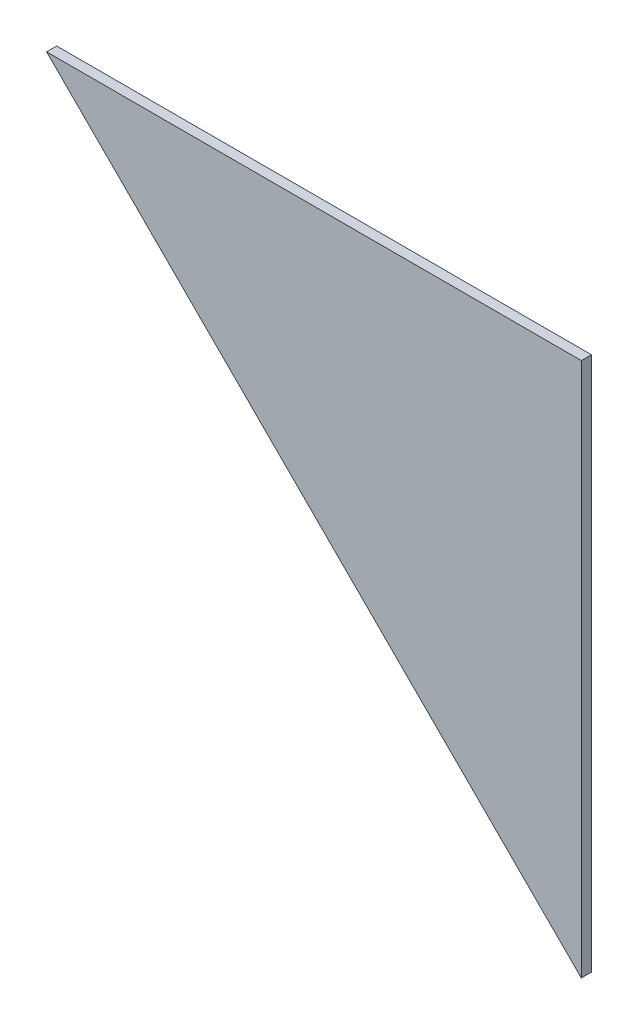
ISO-10303-21;
HEADER;
FILE_DESCRIPTION(('STEP AP214'),'2;1');
FILE_NAME('part.step','',(''),(''),'','','');
FILE_SCHEMA(('AUTOMOTIVE_DESIGN { 1 0 10303 214 1 1 1 1 }'));
ENDSEC;
DATA;
#1=APPLICATION_CONTEXT('core data for automotive mechanical design processes');
#2=APPLICATION_PROTOCOL_DEFINITION('international standard','automotive_design',2000,#1);
#3=PRODUCT_CONTEXT('',#1,'mechanical');
#4=PRODUCT('Part','Part','',(#3));
#5=PRODUCT_RELATED_PRODUCT_CATEGORY('part','',(#4));
#6=PRODUCT_DEFINITION_FORMATION('','',#4);
#7=PRODUCT_DEFINITION_CONTEXT('part definition',#1,'design');
#8=PRODUCT_DEFINITION('design','',#6,#7);
#9=PRODUCT_DEFINITION_SHAPE('','',#8);
#10=(LENGTH_UNIT() NAMED_UNIT(*) SI_UNIT(.MILLI.,.METRE.));
#11=(NAMED_UNIT(*) PLANE_ANGLE_UNIT() SI_UNIT($,.RADIAN.));
#12=(NAMED_UNIT(*) SI_UNIT($,.STERADIAN.) SOLID_ANGLE_UNIT());
#13=UNCERTAINTY_MEASURE_WITH_UNIT(LENGTH_MEASURE(1.E-05),#10,'distance_accuracy_value','');
#14=(GEOMETRIC_REPRESENTATION_CONTEXT(3) GLOBAL_UNCERTAINTY_ASSIGNED_CONTEXT((#13)) GLOBAL_UNIT_ASSIGNED_CONTEXT((#10,
#11,#12)) REPRESENTATION_CONTEXT('',''));
#15=CARTESIAN_POINT('',(0.,0.,0.));
#16=DIRECTION('',(0.,0.,1.));
#17=DIRECTION('',(1.,0.,0.));
#18=AXIS2_PLACEMENT_3D('',#15,#16,#17);
#19=CARTESIAN_POINT('',(-106.066017177982,106.066017177983,2.));
#20=DIRECTION('',(0.707106781186551,0.707106781186544,0.));
#21=DIRECTION('',(-0.707106781186544,0.707106781186551,0.));
#22=AXIS2_PLACEMENT_3D('',#19,#20,#21);
#23=PLANE('',#22);
#24=DIRECTION('',(0.707106781186544,-0.707106781186551,0.));
#25=VECTOR('',#24,1.);
#26=CARTESIAN_POINT('',(-106.066017177982,106.066017177983,0.));
#27=LINE('',#26,#25);
#28=CARTESIAN_POINT('',(-106.066017177982,106.066017177983,0.));
#29=VERTEX_POINT('',#28);
#30=CARTESIAN_POINT('',(0.,0.,0.));
#31=VERTEX_POINT('',#30);
#32=EDGE_CURVE('E80',#29,#31,#27,.T.);
#33=ORIENTED_EDGE('',*,*,#32,.T.);
#34=DIRECTION('',(0.,0.,-1.));
#35=VECTOR('',#34,1.);
#36=CARTESIAN_POINT('',(0.,0.,2.));
#37=LINE('',#36,#35);
#38=CARTESIAN_POINT('',(0.,0.,2.));
#39=VERTEX_POINT('',#38);
#40=EDGE_CURVE('E11',#39,#31,#37,.T.);
#41=ORIENTED_EDGE('',*,*,#40,.F.);
#42=DIRECTION('',(0.707106781186544,-0.707106781186551,0.));
#43=VECTOR('',#42,1.);
#44=CARTESIAN_POINT('',(-106.066017177982,106.066017177983,2.));
#45=LINE('',#44,#43);
#46=CARTESIAN_POINT('',(-106.066017177982,106.066017177983,2.));
#47=VERTEX_POINT('',#46);
#48=EDGE_CURVE('E73',#47,#39,#45,.T.);
#49=ORIENTED_EDGE('',*,*,#48,.F.);
#50=DIRECTION('',(0.,0.,-1.));
#51=VECTOR('',#50,1.);
#52=CARTESIAN_POINT('',(-106.066017177982,106.066017177983,2.));
#53=LINE('',#52,#51);
#54=EDGE_CURVE('E81',#47,#29,#53,.T.);
#55=ORIENTED_EDGE('',*,*,#54,.T.);
#56=EDGE_LOOP('',(#33,#41,#49,#55));
#57=FACE_BOUND('',#56,.T.);
#58=ADVANCED_FACE('F33',(#57),#23,.F.);
#59=CARTESIAN_POINT('',(0.,0.,2.));
#60=DIRECTION('',(-1.,0.,0.));
#61=DIRECTION('',(0.,-1.,0.));
#62=AXIS2_PLACEMENT_3D('',#59,#60,#61);
#63=PLANE('',#62);
#64=DIRECTION('',(0.,1.,0.));
#65=VECTOR('',#64,1.);
#66=CARTESIAN_POINT('',(0.,0.,0.));
#67=LINE('',#66,#65);
#68=CARTESIAN_POINT('',(0.,106.066017177983,0.));
#69=VERTEX_POINT('',#68);
#70=EDGE_CURVE('E61',#31,#69,#67,.T.);
#71=ORIENTED_EDGE('',*,*,#70,.T.);
#72=DIRECTION('',(0.,0.,-1.));
#73=VECTOR('',#72,1.);
#74=CARTESIAN_POINT('',(0.,106.066017177983,2.));
#75=LINE('',#74,#73);
#76=CARTESIAN_POINT('',(0.,106.066017177983,2.));
#77=VERTEX_POINT('',#76);
#78=EDGE_CURVE('E41',#77,#69,#75,.T.);
#79=ORIENTED_EDGE('',*,*,#78,.F.);
#80=DIRECTION('',(0.,1.,0.));
#81=VECTOR('',#80,1.);
#82=CARTESIAN_POINT('',(0.,0.,2.));
#83=LINE('',#82,#81);
#84=EDGE_CURVE('E69',#39,#77,#83,.T.);
#85=ORIENTED_EDGE('',*,*,#84,.F.);
#86=ORIENTED_EDGE('',*,*,#40,.T.);
#87=EDGE_LOOP('',(#71,#79,#85,#86));
#88=FACE_BOUND('',#87,.T.);
#89=ADVANCED_FACE('F70',(#88),#63,.F.);
#90=CARTESIAN_POINT('',(0.,106.066017177983,2.));
#91=DIRECTION('',(0.,-1.,0.));
#92=DIRECTION('',(1.,0.,0.));
#93=AXIS2_PLACEMENT_3D('',#90,#91,#92);
#94=PLANE('',#93);
#95=DIRECTION('',(-1.,0.,0.));
#96=VECTOR('',#95,1.);
#97=CARTESIAN_POINT('',(0.,106.066017177983,0.));
#98=LINE('',#97,#96);
#99=EDGE_CURVE('E66',#69,#29,#98,.T.);
#100=ORIENTED_EDGE('',*,*,#99,.T.);
#101=ORIENTED_EDGE('',*,*,#54,.F.);
#102=DIRECTION('',(-1.,0.,0.));
#103=VECTOR('',#102,1.);
#104=CARTESIAN_POINT('',(0.,106.066017177983,2.));
#105=LINE('',#104,#103);
#106=EDGE_CURVE('E49',#77,#47,#105,.T.);
#107=ORIENTED_EDGE('',*,*,#106,.F.);
#108=ORIENTED_EDGE('',*,*,#78,.T.);
#109=EDGE_LOOP('',(#100,#101,#107,#108));
#110=FACE_BOUND('',#109,.T.);
#111=ADVANCED_FACE('F88',(#110),#94,.F.);
#112=CARTESIAN_POINT('',(0.,0.,2.));
#113=DIRECTION('',(0.,0.,1.));
#114=DIRECTION('',(1.,0.,0.));
#115=AXIS2_PLACEMENT_3D('',#112,#113,#114);
#116=PLANE('',#115);
#117=ORIENTED_EDGE('',*,*,#48,.T.);
#118=ORIENTED_EDGE('',*,*,#84,.T.);
#119=ORIENTED_EDGE('',*,*,#106,.T.);
#120=EDGE_LOOP('',(#117,#118,#119));
#121=FACE_BOUND('',#120,.T.);
#122=ADVANCED_FACE('F76',(#121),#116,.T.);
#123=CARTESIAN_POINT('',(0.,0.,0.));
#124=DIRECTION('',(0.,0.,1.));
#125=DIRECTION('',(1.,0.,0.));
#126=AXIS2_PLACEMENT_3D('',#123,#124,#125);
#127=PLANE('',#126);
#128=ORIENTED_EDGE('',*,*,#32,.F.);
#129=ORIENTED_EDGE('',*,*,#99,.F.);
#130=ORIENTED_EDGE('',*,*,#70,.F.);
#131=EDGE_LOOP('',(#128,#129,#130));
#132=FACE_BOUND('',#131,.T.);
#133=ADVANCED_FACE('F89',(#132),#127,.F.);
#134=CLOSED_SHELL('',(#58,#89,#111,#122,#133));
#135=MANIFOLD_SOLID_BREP('B2',#134);
#136=ADVANCED_BREP_SHAPE_REPRESENTATION('',(#18,#135),#14);
#137=SHAPE_DEFINITION_REPRESENTATION(#9,#136);
ENDSEC;
END-ISO-10303-21;
